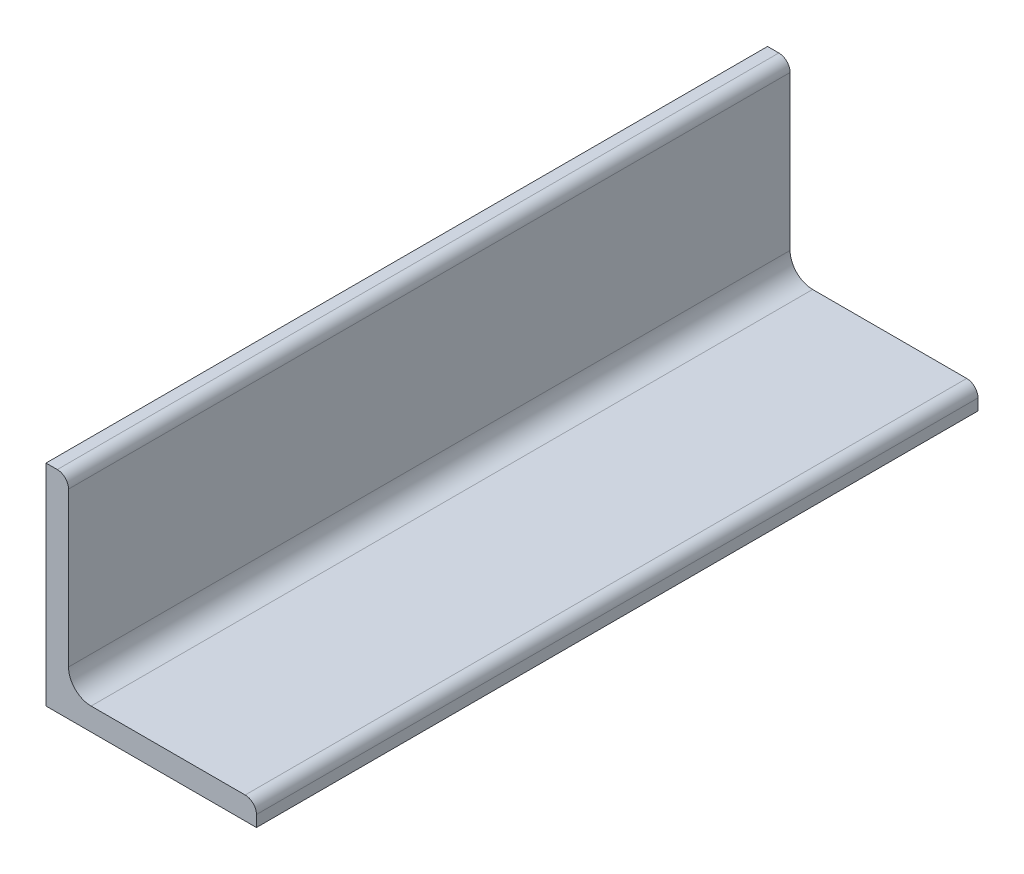
ISO-10303-21;
HEADER;
FILE_DESCRIPTION(('STEP AP214'),'2;1');
FILE_NAME('part.step','',(''),(''),'','','');
FILE_SCHEMA(('AUTOMOTIVE_DESIGN { 1 0 10303 214 1 1 1 1 }'));
ENDSEC;
DATA;
#1=APPLICATION_CONTEXT('core data for automotive mechanical design processes');
#2=APPLICATION_PROTOCOL_DEFINITION('international standard','automotive_design',2000,#1);
#3=PRODUCT_CONTEXT('',#1,'mechanical');
#4=PRODUCT('Part','Part','',(#3));
#5=PRODUCT_RELATED_PRODUCT_CATEGORY('part','',(#4));
#6=PRODUCT_DEFINITION_FORMATION('','',#4);
#7=PRODUCT_DEFINITION_CONTEXT('part definition',#1,'design');
#8=PRODUCT_DEFINITION('design','',#6,#7);
#9=PRODUCT_DEFINITION_SHAPE('','',#8);
#10=(LENGTH_UNIT() NAMED_UNIT(*) SI_UNIT(.MILLI.,.METRE.));
#11=(NAMED_UNIT(*) PLANE_ANGLE_UNIT() SI_UNIT($,.RADIAN.));
#12=(NAMED_UNIT(*) SI_UNIT($,.STERADIAN.) SOLID_ANGLE_UNIT());
#13=UNCERTAINTY_MEASURE_WITH_UNIT(LENGTH_MEASURE(1.E-05),#10,'distance_accuracy_value','');
#14=(GEOMETRIC_REPRESENTATION_CONTEXT(3) GLOBAL_UNCERTAINTY_ASSIGNED_CONTEXT((#13)) GLOBAL_UNIT_ASSIGNED_CONTEXT((#10,
#11,#12)) REPRESENTATION_CONTEXT('',''));
#15=CARTESIAN_POINT('',(0.,0.,0.));
#16=DIRECTION('',(0.,0.,1.));
#17=DIRECTION('',(1.,0.,0.));
#18=AXIS2_PLACEMENT_3D('',#15,#16,#17);
#19=CARTESIAN_POINT('',(0.0836264027816469,89.7372005393545,304.8));
#20=DIRECTION('',(1.,0.,0.));
#21=DIRECTION('',(0.,0.,-1.));
#22=AXIS2_PLACEMENT_3D('',#19,#20,#21);
#23=PLANE('',#22);
#24=DIRECTION('',(0.,-1.,0.));
#25=VECTOR('',#24,1.);
#26=CARTESIAN_POINT('',(0.0836264027816469,89.7372005393545,0.));
#27=LINE('',#26,#25);
#28=CARTESIAN_POINT('',(0.0836264027816469,89.7372005393545,0.));
#29=VERTEX_POINT('',#28);
#30=CARTESIAN_POINT('',(0.0836264027816469,0.837200539354535,0.));
#31=VERTEX_POINT('',#30);
#32=EDGE_CURVE('E135',#29,#31,#27,.T.);
#33=ORIENTED_EDGE('',*,*,#32,.T.);
#34=DIRECTION('',(0.,0.,-1.));
#35=VECTOR('',#34,1.);
#36=CARTESIAN_POINT('',(0.0836264027816469,0.837200539354535,304.8));
#37=LINE('',#36,#35);
#38=CARTESIAN_POINT('',(0.0836264027816469,0.837200539354535,304.8));
#39=VERTEX_POINT('',#38);
#40=EDGE_CURVE('E11',#39,#31,#37,.T.);
#41=ORIENTED_EDGE('',*,*,#40,.F.);
#42=DIRECTION('',(0.,-1.,0.));
#43=VECTOR('',#42,1.);
#44=CARTESIAN_POINT('',(0.0836264027816469,89.7372005393545,304.8));
#45=LINE('',#44,#43);
#46=CARTESIAN_POINT('',(0.0836264027816469,89.7372005393545,304.8));
#47=VERTEX_POINT('',#46);
#48=EDGE_CURVE('E151',#47,#39,#45,.T.);
#49=ORIENTED_EDGE('',*,*,#48,.F.);
#50=DIRECTION('',(0.,0.,-1.));
#51=VECTOR('',#50,1.);
#52=CARTESIAN_POINT('',(0.0836264027816469,89.7372005393545,304.8));
#53=LINE('',#52,#51);
#54=EDGE_CURVE('E131',#47,#29,#53,.T.);
#55=ORIENTED_EDGE('',*,*,#54,.T.);
#56=EDGE_LOOP('',(#33,#41,#49,#55));
#57=FACE_BOUND('',#56,.T.);
#58=ADVANCED_FACE('F33',(#57),#23,.F.);
#59=CARTESIAN_POINT('',(0.0836264027816469,0.837200539354535,304.8));
#60=DIRECTION('',(0.,1.,0.));
#61=DIRECTION('',(0.,0.,1.));
#62=AXIS2_PLACEMENT_3D('',#59,#60,#61);
#63=PLANE('',#62);
#64=DIRECTION('',(1.,0.,0.));
#65=VECTOR('',#64,1.);
#66=CARTESIAN_POINT('',(0.0836264027816469,0.837200539354535,0.));
#67=LINE('',#66,#65);
#68=CARTESIAN_POINT('',(88.9836264027817,0.837200539354535,0.));
#69=VERTEX_POINT('',#68);
#70=EDGE_CURVE('E138',#31,#69,#67,.T.);
#71=ORIENTED_EDGE('',*,*,#70,.T.);
#72=DIRECTION('',(0.,0.,-1.));
#73=VECTOR('',#72,1.);
#74=CARTESIAN_POINT('',(88.9836264027817,0.837200539354535,304.8));
#75=LINE('',#74,#73);
#76=CARTESIAN_POINT('',(88.9836264027817,0.837200539354535,304.8));
#77=VERTEX_POINT('',#76);
#78=EDGE_CURVE('E41',#77,#69,#75,.T.);
#79=ORIENTED_EDGE('',*,*,#78,.F.);
#80=DIRECTION('',(1.,0.,0.));
#81=VECTOR('',#80,1.);
#82=CARTESIAN_POINT('',(0.0836264027816469,0.837200539354535,304.8));
#83=LINE('',#82,#81);
#84=EDGE_CURVE('E95',#39,#77,#83,.T.);
#85=ORIENTED_EDGE('',*,*,#84,.F.);
#86=ORIENTED_EDGE('',*,*,#40,.T.);
#87=EDGE_LOOP('',(#71,#79,#85,#86));
#88=FACE_BOUND('',#87,.T.);
#89=ADVANCED_FACE('F194',(#88),#63,.F.);
#90=CARTESIAN_POINT('',(88.9836264027817,0.837200539354535,304.8));
#91=DIRECTION('',(-1.,0.,0.));
#92=DIRECTION('',(0.,0.,1.));
#93=AXIS2_PLACEMENT_3D('',#90,#91,#92);
#94=PLANE('',#93);
#95=DIRECTION('',(0.,1.,0.));
#96=VECTOR('',#95,1.);
#97=CARTESIAN_POINT('',(88.9836264027817,0.837200539354535,0.));
#98=LINE('',#97,#96);
#99=CARTESIAN_POINT('',(88.9836264027817,5.59970053935453,0.));
#100=VERTEX_POINT('',#99);
#101=EDGE_CURVE('E140',#69,#100,#98,.T.);
#102=ORIENTED_EDGE('',*,*,#101,.T.);
#103=DIRECTION('',(0.,0.,-1.));
#104=VECTOR('',#103,1.);
#105=CARTESIAN_POINT('',(88.9836264027817,5.59970053935453,304.8));
#106=LINE('',#105,#104);
#107=CARTESIAN_POINT('',(88.9836264027817,5.59970053935453,304.8));
#108=VERTEX_POINT('',#107);
#109=EDGE_CURVE('E161',#108,#100,#106,.T.);
#110=ORIENTED_EDGE('',*,*,#109,.F.);
#111=DIRECTION('',(0.,1.,0.));
#112=VECTOR('',#111,1.);
#113=CARTESIAN_POINT('',(88.9836264027817,0.837200539354535,304.8));
#114=LINE('',#113,#112);
#115=EDGE_CURVE('E169',#77,#108,#114,.T.);
#116=ORIENTED_EDGE('',*,*,#115,.F.);
#117=ORIENTED_EDGE('',*,*,#78,.T.);
#118=EDGE_LOOP('',(#102,#110,#116,#117));
#119=FACE_BOUND('',#118,.T.);
#120=ADVANCED_FACE('F167',(#119),#94,.F.);
#121=CARTESIAN_POINT('',(84.2211264027816,5.59970053935453,304.8));
#122=DIRECTION('',(0.,0.,-1.));
#123=DIRECTION('',(-1.,0.,0.));
#124=AXIS2_PLACEMENT_3D('',#121,#122,#123);
#125=CYLINDRICAL_SURFACE('',#124,4.7625);
#126=CARTESIAN_POINT('',(84.2211264027816,5.59970053935453,0.));
#127=DIRECTION('',(0.,0.,1.));
#128=DIRECTION('',(1.,0.,0.));
#129=AXIS2_PLACEMENT_3D('',#126,#127,#128);
#130=CIRCLE('',#129,4.7625);
#131=CARTESIAN_POINT('',(84.2211264027816,10.3622005393545,0.));
#132=VERTEX_POINT('',#131);
#133=EDGE_CURVE('E142',#100,#132,#130,.T.);
#134=ORIENTED_EDGE('',*,*,#133,.T.);
#135=DIRECTION('',(0.,0.,-1.));
#136=VECTOR('',#135,1.);
#137=CARTESIAN_POINT('',(84.2211264027816,10.3622005393545,304.8));
#138=LINE('',#137,#136);
#139=CARTESIAN_POINT('',(84.2211264027816,10.3622005393545,304.8));
#140=VERTEX_POINT('',#139);
#141=EDGE_CURVE('E158',#140,#132,#138,.T.);
#142=ORIENTED_EDGE('',*,*,#141,.F.);
#143=CARTESIAN_POINT('',(84.2211264027816,5.59970053935453,304.8));
#144=DIRECTION('',(0.,0.,1.));
#145=DIRECTION('',(1.,0.,0.));
#146=AXIS2_PLACEMENT_3D('',#143,#144,#145);
#147=CIRCLE('',#146,4.7625);
#148=EDGE_CURVE('E185',#108,#140,#147,.T.);
#149=ORIENTED_EDGE('',*,*,#148,.F.);
#150=ORIENTED_EDGE('',*,*,#109,.T.);
#151=EDGE_LOOP('',(#134,#142,#149,#150));
#152=FACE_BOUND('',#151,.T.);
#153=ADVANCED_FACE('F178',(#152),#125,.T.);
#154=CARTESIAN_POINT('',(84.2211264027816,10.3622005393545,304.8));
#155=DIRECTION('',(0.,-1.,0.));
#156=DIRECTION('',(0.,0.,-1.));
#157=AXIS2_PLACEMENT_3D('',#154,#155,#156);
#158=PLANE('',#157);
#159=DIRECTION('',(-1.,0.,0.));
#160=VECTOR('',#159,1.);
#161=CARTESIAN_POINT('',(84.2211264027816,10.3622005393545,0.));
#162=LINE('',#161,#160);
#163=CARTESIAN_POINT('',(19.1336264027816,10.3622005393545,0.));
#164=VERTEX_POINT('',#163);
#165=EDGE_CURVE('E144',#132,#164,#162,.T.);
#166=ORIENTED_EDGE('',*,*,#165,.T.);
#167=DIRECTION('',(0.,0.,-1.));
#168=VECTOR('',#167,1.);
#169=CARTESIAN_POINT('',(19.1336264027816,10.3622005393545,304.8));
#170=LINE('',#169,#168);
#171=CARTESIAN_POINT('',(19.1336264027816,10.3622005393545,304.8));
#172=VERTEX_POINT('',#171);
#173=EDGE_CURVE('E155',#172,#164,#170,.T.);
#174=ORIENTED_EDGE('',*,*,#173,.F.);
#175=DIRECTION('',(-1.,0.,0.));
#176=VECTOR('',#175,1.);
#177=CARTESIAN_POINT('',(84.2211264027816,10.3622005393545,304.8));
#178=LINE('',#177,#176);
#179=EDGE_CURVE('E184',#140,#172,#178,.T.);
#180=ORIENTED_EDGE('',*,*,#179,.F.);
#181=ORIENTED_EDGE('',*,*,#141,.T.);
#182=EDGE_LOOP('',(#166,#174,#180,#181));
#183=FACE_BOUND('',#182,.T.);
#184=ADVANCED_FACE('F182',(#183),#158,.F.);
#185=CARTESIAN_POINT('',(19.1336264027816,19.8872005393545,304.8));
#186=DIRECTION('',(0.,0.,-1.));
#187=DIRECTION('',(-1.,0.,0.));
#188=AXIS2_PLACEMENT_3D('',#185,#186,#187);
#189=CYLINDRICAL_SURFACE('',#188,9.52499999999999);
#190=CARTESIAN_POINT('',(19.1336264027816,19.8872005393545,0.));
#191=DIRECTION('',(0.,0.,-1.));
#192=DIRECTION('',(1.,0.,0.));
#193=AXIS2_PLACEMENT_3D('',#190,#191,#192);
#194=CIRCLE('',#193,9.52499999999999);
#195=CARTESIAN_POINT('',(9.60862640278164,19.8872005393545,0.));
#196=VERTEX_POINT('',#195);
#197=EDGE_CURVE('E146',#164,#196,#194,.T.);
#198=ORIENTED_EDGE('',*,*,#197,.T.);
#199=DIRECTION('',(0.,0.,-1.));
#200=VECTOR('',#199,1.);
#201=CARTESIAN_POINT('',(9.60862640278164,19.8872005393545,304.8));
#202=LINE('',#201,#200);
#203=CARTESIAN_POINT('',(9.60862640278164,19.8872005393545,304.8));
#204=VERTEX_POINT('',#203);
#205=EDGE_CURVE('E126',#204,#196,#202,.T.);
#206=ORIENTED_EDGE('',*,*,#205,.F.);
#207=CARTESIAN_POINT('',(19.1336264027816,19.8872005393545,304.8));
#208=DIRECTION('',(0.,0.,-1.));
#209=DIRECTION('',(1.,0.,0.));
#210=AXIS2_PLACEMENT_3D('',#207,#208,#209);
#211=CIRCLE('',#210,9.52499999999999);
#212=EDGE_CURVE('E117',#172,#204,#211,.T.);
#213=ORIENTED_EDGE('',*,*,#212,.F.);
#214=ORIENTED_EDGE('',*,*,#173,.T.);
#215=EDGE_LOOP('',(#198,#206,#213,#214));
#216=FACE_BOUND('',#215,.T.);
#217=ADVANCED_FACE('F206',(#216),#189,.F.);
#218=CARTESIAN_POINT('',(9.60862640278165,19.8872005393545,304.8));
#219=DIRECTION('',(-1.,0.,0.));
#220=DIRECTION('',(0.,0.,1.));
#221=AXIS2_PLACEMENT_3D('',#218,#219,#220);
#222=PLANE('',#221);
#223=DIRECTION('',(0.,1.,0.));
#224=VECTOR('',#223,1.);
#225=CARTESIAN_POINT('',(9.60862640278165,19.8872005393545,0.));
#226=LINE('',#225,#224);
#227=CARTESIAN_POINT('',(9.60862640278165,84.9747005393545,0.));
#228=VERTEX_POINT('',#227);
#229=EDGE_CURVE('E125',#196,#228,#226,.T.);
#230=ORIENTED_EDGE('',*,*,#229,.T.);
#231=DIRECTION('',(0.,0.,-1.));
#232=VECTOR('',#231,1.);
#233=CARTESIAN_POINT('',(9.60862640278165,84.9747005393545,304.8));
#234=LINE('',#233,#232);
#235=CARTESIAN_POINT('',(9.60862640278165,84.9747005393545,304.8));
#236=VERTEX_POINT('',#235);
#237=EDGE_CURVE('E122',#236,#228,#234,.T.);
#238=ORIENTED_EDGE('',*,*,#237,.F.);
#239=DIRECTION('',(0.,1.,0.));
#240=VECTOR('',#239,1.);
#241=CARTESIAN_POINT('',(9.60862640278165,19.8872005393545,304.8));
#242=LINE('',#241,#240);
#243=EDGE_CURVE('E111',#204,#236,#242,.T.);
#244=ORIENTED_EDGE('',*,*,#243,.F.);
#245=ORIENTED_EDGE('',*,*,#205,.T.);
#246=EDGE_LOOP('',(#230,#238,#244,#245));
#247=FACE_BOUND('',#246,.T.);
#248=ADVANCED_FACE('F123',(#247),#222,.F.);
#249=CARTESIAN_POINT('',(4.84612640278165,84.9747005393545,304.8));
#250=DIRECTION('',(0.,0.,-1.));
#251=DIRECTION('',(-1.,0.,0.));
#252=AXIS2_PLACEMENT_3D('',#249,#250,#251);
#253=CYLINDRICAL_SURFACE('',#252,4.7625);
#254=CARTESIAN_POINT('',(4.84612640278165,84.9747005393545,0.));
#255=DIRECTION('',(0.,0.,1.));
#256=DIRECTION('',(1.,0.,0.));
#257=AXIS2_PLACEMENT_3D('',#254,#255,#256);
#258=CIRCLE('',#257,4.7625);
#259=CARTESIAN_POINT('',(4.84612640278165,89.7372005393545,0.));
#260=VERTEX_POINT('',#259);
#261=EDGE_CURVE('E81',#228,#260,#258,.T.);
#262=ORIENTED_EDGE('',*,*,#261,.T.);
#263=DIRECTION('',(0.,0.,-1.));
#264=VECTOR('',#263,1.);
#265=CARTESIAN_POINT('',(4.84612640278165,89.7372005393545,304.8));
#266=LINE('',#265,#264);
#267=CARTESIAN_POINT('',(4.84612640278165,89.7372005393545,304.8));
#268=VERTEX_POINT('',#267);
#269=EDGE_CURVE('E127',#268,#260,#266,.T.);
#270=ORIENTED_EDGE('',*,*,#269,.F.);
#271=CARTESIAN_POINT('',(4.84612640278165,84.9747005393545,304.8));
#272=DIRECTION('',(0.,0.,1.));
#273=DIRECTION('',(1.,0.,0.));
#274=AXIS2_PLACEMENT_3D('',#271,#272,#273);
#275=CIRCLE('',#274,4.7625);
#276=EDGE_CURVE('E115',#236,#268,#275,.T.);
#277=ORIENTED_EDGE('',*,*,#276,.F.);
#278=ORIENTED_EDGE('',*,*,#237,.T.);
#279=EDGE_LOOP('',(#262,#270,#277,#278));
#280=FACE_BOUND('',#279,.T.);
#281=ADVANCED_FACE('F129',(#280),#253,.T.);
#282=CARTESIAN_POINT('',(4.84612640278165,89.7372005393545,304.8));
#283=DIRECTION('',(0.,-1.,0.));
#284=DIRECTION('',(0.,0.,-1.));
#285=AXIS2_PLACEMENT_3D('',#282,#283,#284);
#286=PLANE('',#285);
#287=DIRECTION('',(-1.,0.,0.));
#288=VECTOR('',#287,1.);
#289=CARTESIAN_POINT('',(4.84612640278165,89.7372005393545,0.));
#290=LINE('',#289,#288);
#291=EDGE_CURVE('E87',#260,#29,#290,.T.);
#292=ORIENTED_EDGE('',*,*,#291,.T.);
#293=ORIENTED_EDGE('',*,*,#54,.F.);
#294=DIRECTION('',(-1.,0.,0.));
#295=VECTOR('',#294,1.);
#296=CARTESIAN_POINT('',(4.84612640278165,89.7372005393545,304.8));
#297=LINE('',#296,#295);
#298=EDGE_CURVE('E49',#268,#47,#297,.T.);
#299=ORIENTED_EDGE('',*,*,#298,.F.);
#300=ORIENTED_EDGE('',*,*,#269,.T.);
#301=EDGE_LOOP('',(#292,#293,#299,#300));
#302=FACE_BOUND('',#301,.T.);
#303=ADVANCED_FACE('F214',(#302),#286,.F.);
#304=CARTESIAN_POINT('',(84.2211264027816,5.59970053935453,304.8));
#305=DIRECTION('',(0.,0.,1.));
#306=DIRECTION('',(1.,0.,0.));
#307=AXIS2_PLACEMENT_3D('',#304,#305,#306);
#308=PLANE('',#307);
#309=ORIENTED_EDGE('',*,*,#48,.T.);
#310=ORIENTED_EDGE('',*,*,#84,.T.);
#311=ORIENTED_EDGE('',*,*,#115,.T.);
#312=ORIENTED_EDGE('',*,*,#148,.T.);
#313=ORIENTED_EDGE('',*,*,#179,.T.);
#314=ORIENTED_EDGE('',*,*,#212,.T.);
#315=ORIENTED_EDGE('',*,*,#243,.T.);
#316=ORIENTED_EDGE('',*,*,#276,.T.);
#317=ORIENTED_EDGE('',*,*,#298,.T.);
#318=EDGE_LOOP('',(#309,#310,#311,#312,#313,#314,#315,#316,#317));
#319=FACE_BOUND('',#318,.T.);
#320=ADVANCED_FACE('F113',(#319),#308,.T.);
#321=CARTESIAN_POINT('',(84.2211264027816,5.59970053935453,0.));
#322=DIRECTION('',(0.,0.,1.));
#323=DIRECTION('',(1.,0.,0.));
#324=AXIS2_PLACEMENT_3D('',#321,#322,#323);
#325=PLANE('',#324);
#326=ORIENTED_EDGE('',*,*,#32,.F.);
#327=ORIENTED_EDGE('',*,*,#291,.F.);
#328=ORIENTED_EDGE('',*,*,#261,.F.);
#329=ORIENTED_EDGE('',*,*,#229,.F.);
#330=ORIENTED_EDGE('',*,*,#197,.F.);
#331=ORIENTED_EDGE('',*,*,#165,.F.);
#332=ORIENTED_EDGE('',*,*,#133,.F.);
#333=ORIENTED_EDGE('',*,*,#101,.F.);
#334=ORIENTED_EDGE('',*,*,#70,.F.);
#335=EDGE_LOOP('',(#326,#327,#328,#329,#330,#331,#332,#333,#334));
#336=FACE_BOUND('',#335,.T.);
#337=ADVANCED_FACE('F173',(#336),#325,.F.);
#338=CLOSED_SHELL('',(#58,#89,#120,#153,#184,#217,#248,#281,#303,#320,#337));
#339=MANIFOLD_SOLID_BREP('B2',#338);
#340=ADVANCED_BREP_SHAPE_REPRESENTATION('',(#18,#339),#14);
#341=SHAPE_DEFINITION_REPRESENTATION(#9,#340);
ENDSEC;
END-ISO-10303-21;
